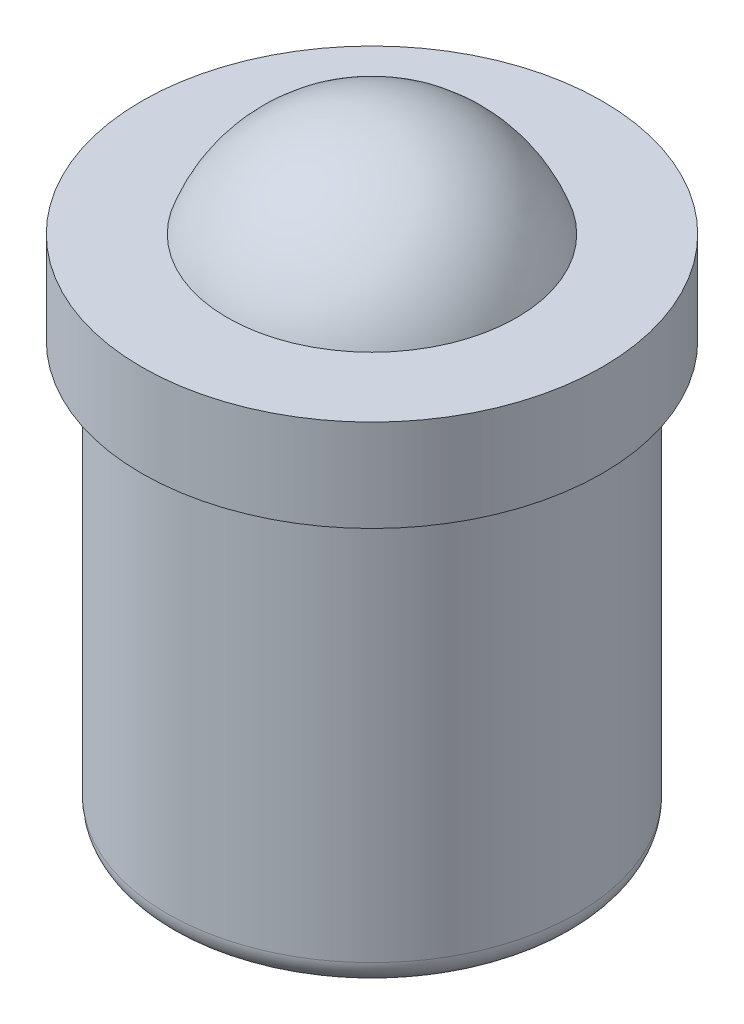
ISO-10303-21;
HEADER;
FILE_DESCRIPTION(('STEP AP214'),'2;1');
FILE_NAME('part.step','',(''),(''),'','','');
FILE_SCHEMA(('AUTOMOTIVE_DESIGN { 1 0 10303 214 1 1 1 1 }'));
ENDSEC;
DATA;
#1=APPLICATION_CONTEXT('core data for automotive mechanical design processes');
#2=APPLICATION_PROTOCOL_DEFINITION('international standard','automotive_design',2000,#1);
#3=PRODUCT_CONTEXT('',#1,'mechanical');
#4=PRODUCT('Part','Part','',(#3));
#5=PRODUCT_RELATED_PRODUCT_CATEGORY('part','',(#4));
#6=PRODUCT_DEFINITION_FORMATION('','',#4);
#7=PRODUCT_DEFINITION_CONTEXT('part definition',#1,'design');
#8=PRODUCT_DEFINITION('design','',#6,#7);
#9=PRODUCT_DEFINITION_SHAPE('','',#8);
#10=(LENGTH_UNIT() NAMED_UNIT(*) SI_UNIT(.MILLI.,.METRE.));
#11=(NAMED_UNIT(*) PLANE_ANGLE_UNIT() SI_UNIT($,.RADIAN.));
#12=(NAMED_UNIT(*) SI_UNIT($,.STERADIAN.) SOLID_ANGLE_UNIT());
#13=UNCERTAINTY_MEASURE_WITH_UNIT(LENGTH_MEASURE(1.E-05),#10,'distance_accuracy_value','');
#14=(GEOMETRIC_REPRESENTATION_CONTEXT(3) GLOBAL_UNCERTAINTY_ASSIGNED_CONTEXT((#13)) GLOBAL_UNIT_ASSIGNED_CONTEXT((#10,
#11,#12)) REPRESENTATION_CONTEXT('',''));
#15=CARTESIAN_POINT('',(0.,0.,0.));
#16=DIRECTION('',(0.,0.,1.));
#17=DIRECTION('',(1.,0.,0.));
#18=AXIS2_PLACEMENT_3D('',#15,#16,#17);
#19=CARTESIAN_POINT('',(0.,0.,0.));
#20=DIRECTION('',(0.,-1.,0.));
#21=DIRECTION('',(1.,0.,0.));
#22=AXIS2_PLACEMENT_3D('',#19,#20,#21);
#23=PLANE('',#22);
#24=CARTESIAN_POINT('',(0.,0.,0.));
#25=DIRECTION('',(0.,-1.,0.));
#26=DIRECTION('',(1.,0.,0.));
#27=AXIS2_PLACEMENT_3D('',#24,#25,#26);
#28=CIRCLE('',#27,1.75);
#29=CARTESIAN_POINT('',(1.75,0.,0.));
#30=VERTEX_POINT('',#29);
#31=EDGE_CURVE('E10',#30,#30,#28,.T.);
#32=ORIENTED_EDGE('',*,*,#31,.T.);
#33=EDGE_LOOP('',(#32));
#34=FACE_BOUND('',#33,.T.);
#35=ADVANCED_FACE('F43',(#34),#23,.T.);
#36=CARTESIAN_POINT('',(0.,6.00000000000001,0.));
#37=DIRECTION('',(0.,1.,0.));
#38=DIRECTION('',(-1.,0.,0.));
#39=AXIS2_PLACEMENT_3D('',#36,#37,#38);
#40=CYLINDRICAL_SURFACE('',#39,2.);
#41=CARTESIAN_POINT('',(0.,0.25,0.));
#42=DIRECTION('',(0.,-1.,0.));
#43=DIRECTION('',(1.,0.,0.));
#44=AXIS2_PLACEMENT_3D('',#41,#42,#43);
#45=CIRCLE('',#44,2.);
#46=CARTESIAN_POINT('',(2.,0.25,0.));
#47=VERTEX_POINT('',#46);
#48=EDGE_CURVE('E51',#47,#47,#45,.F.);
#49=ORIENTED_EDGE('',*,*,#48,.T.);
#50=EDGE_LOOP('',(#49));
#51=FACE_BOUND('',#50,.T.);
#52=CARTESIAN_POINT('',(0.,4.1,0.));
#53=DIRECTION('',(0.,1.,0.));
#54=DIRECTION('',(-1.,0.,0.));
#55=AXIS2_PLACEMENT_3D('',#52,#53,#54);
#56=CIRCLE('',#55,2.);
#57=CARTESIAN_POINT('',(-2.,4.1,0.));
#58=VERTEX_POINT('',#57);
#59=EDGE_CURVE('E56',#58,#58,#56,.T.);
#60=ORIENTED_EDGE('',*,*,#59,.F.);
#61=EDGE_LOOP('',(#60));
#62=FACE_BOUND('',#61,.T.);
#63=ADVANCED_FACE('F92',(#51,#62),#40,.T.);
#64=CARTESIAN_POINT('',(-2.,4.1,0.));
#65=DIRECTION('',(0.,-1.,0.));
#66=DIRECTION('',(1.,0.,0.));
#67=AXIS2_PLACEMENT_3D('',#64,#65,#66);
#68=PLANE('',#67);
#69=ORIENTED_EDGE('',*,*,#59,.T.);
#70=EDGE_LOOP('',(#69));
#71=FACE_BOUND('',#70,.T.);
#72=CARTESIAN_POINT('',(0.,4.1,0.));
#73=DIRECTION('',(0.,1.,0.));
#74=DIRECTION('',(-1.,0.,0.));
#75=AXIS2_PLACEMENT_3D('',#72,#73,#74);
#76=CIRCLE('',#75,2.25);
#77=CARTESIAN_POINT('',(-2.25,4.1,0.));
#78=VERTEX_POINT('',#77);
#79=EDGE_CURVE('E61',#78,#78,#76,.T.);
#80=ORIENTED_EDGE('',*,*,#79,.F.);
#81=EDGE_LOOP('',(#80));
#82=FACE_BOUND('',#81,.T.);
#83=ADVANCED_FACE('F88',(#71,#82),#68,.T.);
#84=CARTESIAN_POINT('',(0.,6.00000000000001,0.));
#85=DIRECTION('',(0.,1.,0.));
#86=DIRECTION('',(-1.,0.,0.));
#87=AXIS2_PLACEMENT_3D('',#84,#85,#86);
#88=CYLINDRICAL_SURFACE('',#87,2.25);
#89=ORIENTED_EDGE('',*,*,#79,.T.);
#90=EDGE_LOOP('',(#89));
#91=FACE_BOUND('',#90,.T.);
#92=CARTESIAN_POINT('',(0.,5.,0.));
#93=DIRECTION('',(0.,1.,0.));
#94=DIRECTION('',(-1.,0.,0.));
#95=AXIS2_PLACEMENT_3D('',#92,#93,#94);
#96=CIRCLE('',#95,2.25);
#97=CARTESIAN_POINT('',(-2.25,5.,0.));
#98=VERTEX_POINT('',#97);
#99=EDGE_CURVE('E67',#98,#98,#96,.T.);
#100=ORIENTED_EDGE('',*,*,#99,.F.);
#101=EDGE_LOOP('',(#100));
#102=FACE_BOUND('',#101,.T.);
#103=ADVANCED_FACE('F80',(#91,#102),#88,.T.);
#104=CARTESIAN_POINT('',(-2.25,5.,0.));
#105=DIRECTION('',(0.,1.,0.));
#106=DIRECTION('',(-1.,0.,0.));
#107=AXIS2_PLACEMENT_3D('',#104,#105,#106);
#108=PLANE('',#107);
#109=ORIENTED_EDGE('',*,*,#99,.T.);
#110=EDGE_LOOP('',(#109));
#111=FACE_BOUND('',#110,.T.);
#112=CARTESIAN_POINT('',(0.,5.,0.));
#113=DIRECTION('',(0.,1.,0.));
#114=DIRECTION('',(-1.,0.,0.));
#115=AXIS2_PLACEMENT_3D('',#112,#113,#114);
#116=CIRCLE('',#115,1.4142135623731);
#117=CARTESIAN_POINT('',(-1.4142135623731,5.,0.));
#118=VERTEX_POINT('',#117);
#119=EDGE_CURVE('E71',#118,#118,#116,.T.);
#120=ORIENTED_EDGE('',*,*,#119,.F.);
#121=EDGE_LOOP('',(#120));
#122=FACE_BOUND('',#121,.T.);
#123=ADVANCED_FACE('F78',(#111,#122),#108,.T.);
#124=CARTESIAN_POINT('',(0.,4.50000000000001,0.));
#125=DIRECTION('',(0.,1.,0.));
#126=DIRECTION('',(-1.,0.,0.));
#127=AXIS2_PLACEMENT_3D('',#124,#125,#126);
#128=SPHERICAL_SURFACE('',#127,1.5);
#129=ORIENTED_EDGE('',*,*,#119,.T.);
#130=EDGE_LOOP('',(#129));
#131=FACE_BOUND('',#130,.T.);
#132=ADVANCED_FACE('F76',(#131),#128,.T.);
#133=CARTESIAN_POINT('',(0.,0.25,0.));
#134=DIRECTION('',(0.,-1.,0.));
#135=DIRECTION('',(1.,0.,0.));
#136=AXIS2_PLACEMENT_3D('',#133,#134,#135);
#137=TOROIDAL_SURFACE('',#136,1.75,0.25);
#138=ORIENTED_EDGE('',*,*,#31,.F.);
#139=EDGE_LOOP('',(#138));
#140=FACE_BOUND('',#139,.T.);
#141=ORIENTED_EDGE('',*,*,#48,.F.);
#142=EDGE_LOOP('',(#141));
#143=FACE_BOUND('',#142,.T.);
#144=ADVANCED_FACE('F45',(#140,#143),#137,.T.);
#145=CLOSED_SHELL('',(#35,#63,#83,#103,#123,#132,#144));
#146=MANIFOLD_SOLID_BREP('B2',#145);
#147=ADVANCED_BREP_SHAPE_REPRESENTATION('',(#18,#146),#14);
#148=SHAPE_DEFINITION_REPRESENTATION(#9,#147);
ENDSEC;
END-ISO-10303-21;
